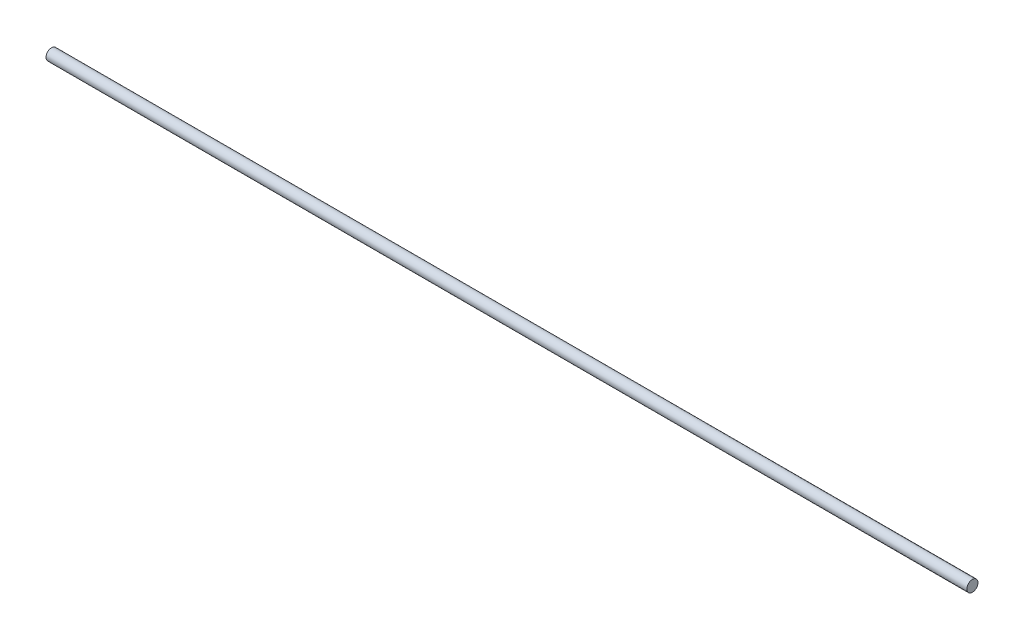
ISO-10303-21;
HEADER;
FILE_DESCRIPTION(('STEP AP214'),'2;1');
FILE_NAME('part.step','',(''),(''),'','','');
FILE_SCHEMA(('AUTOMOTIVE_DESIGN { 1 0 10303 214 1 1 1 1 }'));
ENDSEC;
DATA;
#1=APPLICATION_CONTEXT('core data for automotive mechanical design processes');
#2=APPLICATION_PROTOCOL_DEFINITION('international standard','automotive_design',2000,#1);
#3=PRODUCT_CONTEXT('',#1,'mechanical');
#4=PRODUCT('Part','Part','',(#3));
#5=PRODUCT_RELATED_PRODUCT_CATEGORY('part','',(#4));
#6=PRODUCT_DEFINITION_FORMATION('','',#4);
#7=PRODUCT_DEFINITION_CONTEXT('part definition',#1,'design');
#8=PRODUCT_DEFINITION('design','',#6,#7);
#9=PRODUCT_DEFINITION_SHAPE('','',#8);
#10=(LENGTH_UNIT() NAMED_UNIT(*) SI_UNIT(.MILLI.,.METRE.));
#11=(NAMED_UNIT(*) PLANE_ANGLE_UNIT() SI_UNIT($,.RADIAN.));
#12=(NAMED_UNIT(*) SI_UNIT($,.STERADIAN.) SOLID_ANGLE_UNIT());
#13=UNCERTAINTY_MEASURE_WITH_UNIT(LENGTH_MEASURE(1.E-05),#10,'distance_accuracy_value','');
#14=(GEOMETRIC_REPRESENTATION_CONTEXT(3) GLOBAL_UNCERTAINTY_ASSIGNED_CONTEXT((#13)) GLOBAL_UNIT_ASSIGNED_CONTEXT((#10,
#11,#12)) REPRESENTATION_CONTEXT('',''));
#15=CARTESIAN_POINT('',(0.,0.,0.));
#16=DIRECTION('',(0.,0.,1.));
#17=DIRECTION('',(1.,0.,0.));
#18=AXIS2_PLACEMENT_3D('',#15,#16,#17);
#19=CARTESIAN_POINT('',(198.12,0.,0.));
#20=DIRECTION('',(-1.,0.,0.));
#21=DIRECTION('',(0.,0.,1.));
#22=AXIS2_PLACEMENT_3D('',#19,#20,#21);
#23=CYLINDRICAL_SURFACE('',#22,1.2);
#24=CARTESIAN_POINT('',(198.12,0.,0.));
#25=DIRECTION('',(1.,0.,0.));
#26=DIRECTION('',(0.,0.,-1.));
#27=AXIS2_PLACEMENT_3D('',#24,#25,#26);
#28=CIRCLE('',#27,1.2);
#29=CARTESIAN_POINT('',(198.12,0.,-1.2));
#30=VERTEX_POINT('',#29);
#31=EDGE_CURVE('E10',#30,#30,#28,.T.);
#32=ORIENTED_EDGE('',*,*,#31,.F.);
#33=EDGE_LOOP('',(#32));
#34=FACE_BOUND('',#33,.T.);
#35=CARTESIAN_POINT('',(0.,0.,0.));
#36=DIRECTION('',(1.,0.,0.));
#37=DIRECTION('',(0.,0.,-1.));
#38=AXIS2_PLACEMENT_3D('',#35,#36,#37);
#39=CIRCLE('',#38,1.2);
#40=CARTESIAN_POINT('',(0.,0.,-1.2));
#41=VERTEX_POINT('',#40);
#42=EDGE_CURVE('E46',#41,#41,#39,.T.);
#43=ORIENTED_EDGE('',*,*,#42,.T.);
#44=EDGE_LOOP('',(#43));
#45=FACE_BOUND('',#44,.T.);
#46=ADVANCED_FACE('F43',(#34,#45),#23,.T.);
#47=CARTESIAN_POINT('',(198.12,0.,0.));
#48=DIRECTION('',(1.,0.,0.));
#49=DIRECTION('',(0.,0.,-1.));
#50=AXIS2_PLACEMENT_3D('',#47,#48,#49);
#51=PLANE('',#50);
#52=ORIENTED_EDGE('',*,*,#31,.T.);
#53=EDGE_LOOP('',(#52));
#54=FACE_BOUND('',#53,.T.);
#55=ADVANCED_FACE('F60',(#54),#51,.T.);
#56=CARTESIAN_POINT('',(0.,0.,0.));
#57=DIRECTION('',(1.,0.,0.));
#58=DIRECTION('',(0.,0.,-1.));
#59=AXIS2_PLACEMENT_3D('',#56,#57,#58);
#60=PLANE('',#59);
#61=ORIENTED_EDGE('',*,*,#42,.F.);
#62=EDGE_LOOP('',(#61));
#63=FACE_BOUND('',#62,.T.);
#64=ADVANCED_FACE('F58',(#63),#60,.F.);
#65=CLOSED_SHELL('',(#46,#55,#64));
#66=MANIFOLD_SOLID_BREP('B2',#65);
#67=ADVANCED_BREP_SHAPE_REPRESENTATION('',(#18,#66),#14);
#68=SHAPE_DEFINITION_REPRESENTATION(#9,#67);
ENDSEC;
END-ISO-10303-21;
